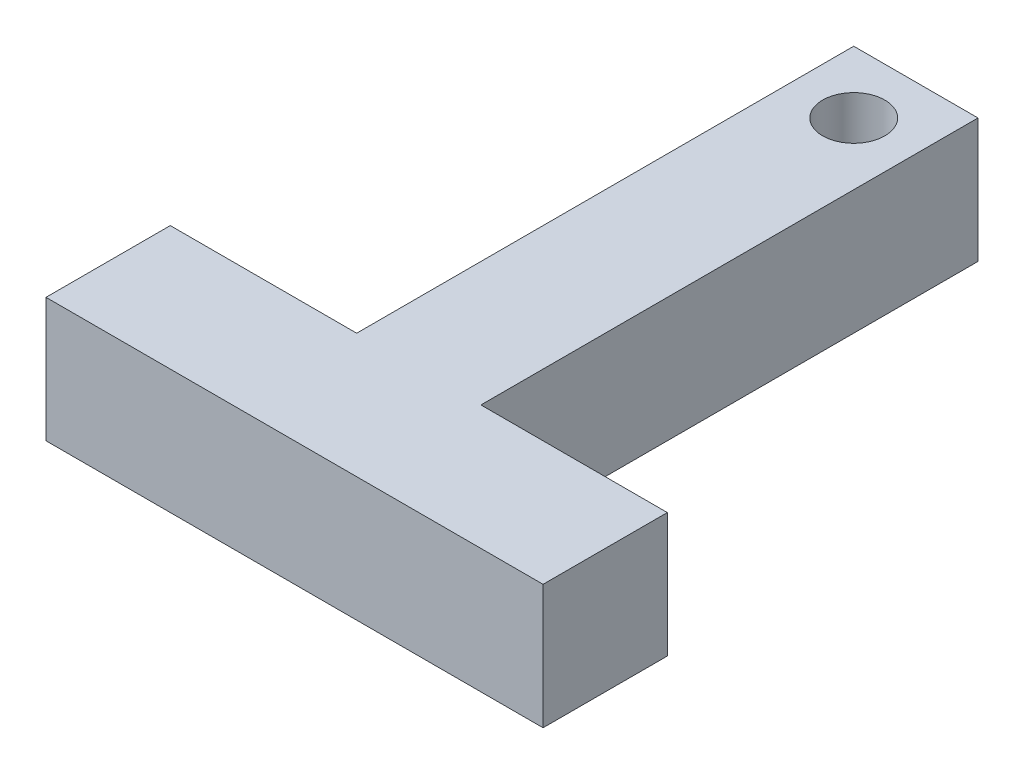
ISO-10303-21;
HEADER;
FILE_DESCRIPTION(('STEP AP214'),'2;1');
FILE_NAME('part.step','',(''),(''),'','','');
FILE_SCHEMA(('AUTOMOTIVE_DESIGN { 1 0 10303 214 1 1 1 1 }'));
ENDSEC;
DATA;
#1=APPLICATION_CONTEXT('core data for automotive mechanical design processes');
#2=APPLICATION_PROTOCOL_DEFINITION('international standard','automotive_design',2000,#1);
#3=PRODUCT_CONTEXT('',#1,'mechanical');
#4=PRODUCT('Part','Part','',(#3));
#5=PRODUCT_RELATED_PRODUCT_CATEGORY('part','',(#4));
#6=PRODUCT_DEFINITION_FORMATION('','',#4);
#7=PRODUCT_DEFINITION_CONTEXT('part definition',#1,'design');
#8=PRODUCT_DEFINITION('design','',#6,#7);
#9=PRODUCT_DEFINITION_SHAPE('','',#8);
#10=(LENGTH_UNIT() NAMED_UNIT(*) SI_UNIT(.MILLI.,.METRE.));
#11=(NAMED_UNIT(*) PLANE_ANGLE_UNIT() SI_UNIT($,.RADIAN.));
#12=(NAMED_UNIT(*) SI_UNIT($,.STERADIAN.) SOLID_ANGLE_UNIT());
#13=UNCERTAINTY_MEASURE_WITH_UNIT(LENGTH_MEASURE(1.E-05),#10,'distance_accuracy_value','');
#14=(GEOMETRIC_REPRESENTATION_CONTEXT(3) GLOBAL_UNCERTAINTY_ASSIGNED_CONTEXT((#13)) GLOBAL_UNIT_ASSIGNED_CONTEXT((#10,
#11,#12)) REPRESENTATION_CONTEXT('',''));
#15=CARTESIAN_POINT('',(0.,0.,0.));
#16=DIRECTION('',(0.,0.,1.));
#17=DIRECTION('',(1.,0.,0.));
#18=AXIS2_PLACEMENT_3D('',#15,#16,#17);
#19=CARTESIAN_POINT('',(1.99999999999999,1.,-35.7707081392257));
#20=DIRECTION('',(-1.,0.,0.));
#21=DIRECTION('',(0.,0.,1.));
#22=AXIS2_PLACEMENT_3D('',#19,#20,#21);
#23=PLANE('',#22);
#24=DIRECTION('',(0.,0.,-1.));
#25=VECTOR('',#24,1.);
#26=CARTESIAN_POINT('',(1.99999999999999,0.,-35.7707081392257));
#27=LINE('',#26,#25);
#28=CARTESIAN_POINT('',(1.99999999999999,0.,-34.7707081392257));
#29=VERTEX_POINT('',#28);
#30=CARTESIAN_POINT('',(1.99999999999999,0.,-35.7707081392257));
#31=VERTEX_POINT('',#30);
#32=EDGE_CURVE('E131',#29,#31,#27,.T.);
#33=ORIENTED_EDGE('',*,*,#32,.T.);
#34=DIRECTION('',(0.,-1.,0.));
#35=VECTOR('',#34,1.);
#36=CARTESIAN_POINT('',(1.99999999999999,1.,-35.7707081392257));
#37=LINE('',#36,#35);
#38=CARTESIAN_POINT('',(1.99999999999999,1.,-35.7707081392257));
#39=VERTEX_POINT('',#38);
#40=EDGE_CURVE('E11',#39,#31,#37,.T.);
#41=ORIENTED_EDGE('',*,*,#40,.F.);
#42=DIRECTION('',(0.,0.,-1.));
#43=VECTOR('',#42,1.);
#44=CARTESIAN_POINT('',(1.99999999999999,1.,-35.7707081392257));
#45=LINE('',#44,#43);
#46=CARTESIAN_POINT('',(1.99999999999999,1.,-34.7707081392257));
#47=VERTEX_POINT('',#46);
#48=EDGE_CURVE('E146',#47,#39,#45,.T.);
#49=ORIENTED_EDGE('',*,*,#48,.F.);
#50=DIRECTION('',(0.,-1.,0.));
#51=VECTOR('',#50,1.);
#52=CARTESIAN_POINT('',(1.99999999999999,1.,-34.7707081392257));
#53=LINE('',#52,#51);
#54=EDGE_CURVE('E127',#47,#29,#53,.T.);
#55=ORIENTED_EDGE('',*,*,#54,.T.);
#56=EDGE_LOOP('',(#33,#41,#49,#55));
#57=FACE_BOUND('',#56,.T.);
#58=ADVANCED_FACE('F35',(#57),#23,.F.);
#59=CARTESIAN_POINT('',(0.499999999999996,1.,-35.7707081392257));
#60=DIRECTION('',(0.,0.,1.));
#61=DIRECTION('',(1.,0.,0.));
#62=AXIS2_PLACEMENT_3D('',#59,#60,#61);
#63=PLANE('',#62);
#64=DIRECTION('',(-1.,0.,0.));
#65=VECTOR('',#64,1.);
#66=CARTESIAN_POINT('',(0.499999999999996,0.,-35.7707081392257));
#67=LINE('',#66,#65);
#68=CARTESIAN_POINT('',(0.499999999999996,0.,-35.7707081392257));
#69=VERTEX_POINT('',#68);
#70=EDGE_CURVE('E134',#31,#69,#67,.T.);
#71=ORIENTED_EDGE('',*,*,#70,.T.);
#72=DIRECTION('',(0.,-1.,0.));
#73=VECTOR('',#72,1.);
#74=CARTESIAN_POINT('',(0.499999999999996,1.,-35.7707081392257));
#75=LINE('',#74,#73);
#76=CARTESIAN_POINT('',(0.499999999999996,1.,-35.7707081392257));
#77=VERTEX_POINT('',#76);
#78=EDGE_CURVE('E43',#77,#69,#75,.T.);
#79=ORIENTED_EDGE('',*,*,#78,.F.);
#80=DIRECTION('',(-1.,0.,0.));
#81=VECTOR('',#80,1.);
#82=CARTESIAN_POINT('',(0.499999999999996,1.,-35.7707081392257));
#83=LINE('',#82,#81);
#84=EDGE_CURVE('E94',#39,#77,#83,.T.);
#85=ORIENTED_EDGE('',*,*,#84,.F.);
#86=ORIENTED_EDGE('',*,*,#40,.T.);
#87=EDGE_LOOP('',(#71,#79,#85,#86));
#88=FACE_BOUND('',#87,.T.);
#89=ADVANCED_FACE('F202',(#88),#63,.F.);
#90=CARTESIAN_POINT('',(0.499999999999995,1.,-39.7707081392257));
#91=DIRECTION('',(-1.,0.,0.));
#92=DIRECTION('',(0.,0.,1.));
#93=AXIS2_PLACEMENT_3D('',#90,#91,#92);
#94=PLANE('',#93);
#95=DIRECTION('',(0.,0.,-1.));
#96=VECTOR('',#95,1.);
#97=CARTESIAN_POINT('',(0.499999999999995,0.,-39.7707081392257));
#98=LINE('',#97,#96);
#99=CARTESIAN_POINT('',(0.499999999999995,0.,-39.7707081392257));
#100=VERTEX_POINT('',#99);
#101=EDGE_CURVE('E137',#69,#100,#98,.T.);
#102=ORIENTED_EDGE('',*,*,#101,.T.);
#103=DIRECTION('',(0.,-1.,0.));
#104=VECTOR('',#103,1.);
#105=CARTESIAN_POINT('',(0.499999999999995,1.,-39.7707081392257));
#106=LINE('',#105,#104);
#107=CARTESIAN_POINT('',(0.499999999999995,1.,-39.7707081392257));
#108=VERTEX_POINT('',#107);
#109=EDGE_CURVE('E153',#108,#100,#106,.T.);
#110=ORIENTED_EDGE('',*,*,#109,.F.);
#111=DIRECTION('',(0.,0.,-1.));
#112=VECTOR('',#111,1.);
#113=CARTESIAN_POINT('',(0.499999999999995,1.,-39.7707081392257));
#114=LINE('',#113,#112);
#115=EDGE_CURVE('E161',#77,#108,#114,.T.);
#116=ORIENTED_EDGE('',*,*,#115,.F.);
#117=ORIENTED_EDGE('',*,*,#78,.T.);
#118=EDGE_LOOP('',(#102,#110,#116,#117));
#119=FACE_BOUND('',#118,.T.);
#120=ADVANCED_FACE('F159',(#119),#94,.F.);
#121=CARTESIAN_POINT('',(-0.500000000000005,1.,-39.7707081392257));
#122=DIRECTION('',(0.,0.,1.));
#123=DIRECTION('',(1.,0.,0.));
#124=AXIS2_PLACEMENT_3D('',#121,#122,#123);
#125=PLANE('',#124);
#126=DIRECTION('',(-1.,0.,0.));
#127=VECTOR('',#126,1.);
#128=CARTESIAN_POINT('',(-0.500000000000005,0.,-39.7707081392257));
#129=LINE('',#128,#127);
#130=CARTESIAN_POINT('',(-0.500000000000005,0.,-39.7707081392257));
#131=VERTEX_POINT('',#130);
#132=EDGE_CURVE('E139',#100,#131,#129,.T.);
#133=ORIENTED_EDGE('',*,*,#132,.T.);
#134=DIRECTION('',(0.,-1.,0.));
#135=VECTOR('',#134,1.);
#136=CARTESIAN_POINT('',(-0.500000000000005,1.,-39.7707081392257));
#137=LINE('',#136,#135);
#138=CARTESIAN_POINT('',(-0.500000000000005,1.,-39.7707081392257));
#139=VERTEX_POINT('',#138);
#140=EDGE_CURVE('E150',#139,#131,#137,.T.);
#141=ORIENTED_EDGE('',*,*,#140,.F.);
#142=DIRECTION('',(-1.,0.,0.));
#143=VECTOR('',#142,1.);
#144=CARTESIAN_POINT('',(-0.500000000000005,1.,-39.7707081392257));
#145=LINE('',#144,#143);
#146=EDGE_CURVE('E173',#108,#139,#145,.T.);
#147=ORIENTED_EDGE('',*,*,#146,.F.);
#148=ORIENTED_EDGE('',*,*,#109,.T.);
#149=EDGE_LOOP('',(#133,#141,#147,#148));
#150=FACE_BOUND('',#149,.T.);
#151=ADVANCED_FACE('F169',(#150),#125,.F.);
#152=CARTESIAN_POINT('',(-0.500000000000005,1.,-39.7707081392257));
#153=DIRECTION('',(1.,0.,0.));
#154=DIRECTION('',(0.,0.,-1.));
#155=AXIS2_PLACEMENT_3D('',#152,#153,#154);
#156=PLANE('',#155);
#157=DIRECTION('',(0.,0.,1.));
#158=VECTOR('',#157,1.);
#159=CARTESIAN_POINT('',(-0.500000000000005,0.,-39.7707081392257));
#160=LINE('',#159,#158);
#161=CARTESIAN_POINT('',(-0.500000000000005,0.,-35.7707081392257));
#162=VERTEX_POINT('',#161);
#163=EDGE_CURVE('E141',#131,#162,#160,.T.);
#164=ORIENTED_EDGE('',*,*,#163,.T.);
#165=DIRECTION('',(0.,-1.,0.));
#166=VECTOR('',#165,1.);
#167=CARTESIAN_POINT('',(-0.500000000000005,1.,-35.7707081392257));
#168=LINE('',#167,#166);
#169=CARTESIAN_POINT('',(-0.500000000000005,1.,-35.7707081392257));
#170=VERTEX_POINT('',#169);
#171=EDGE_CURVE('E122',#170,#162,#168,.T.);
#172=ORIENTED_EDGE('',*,*,#171,.F.);
#173=DIRECTION('',(0.,0.,1.));
#174=VECTOR('',#173,1.);
#175=CARTESIAN_POINT('',(-0.500000000000005,1.,-39.7707081392257));
#176=LINE('',#175,#174);
#177=EDGE_CURVE('E113',#139,#170,#176,.T.);
#178=ORIENTED_EDGE('',*,*,#177,.F.);
#179=ORIENTED_EDGE('',*,*,#140,.T.);
#180=EDGE_LOOP('',(#164,#172,#178,#179));
#181=FACE_BOUND('',#180,.T.);
#182=ADVANCED_FACE('F172',(#181),#156,.F.);
#183=CARTESIAN_POINT('',(-2.00000000000001,1.,-35.7707081392257));
#184=DIRECTION('',(0.,0.,1.));
#185=DIRECTION('',(1.,0.,0.));
#186=AXIS2_PLACEMENT_3D('',#183,#184,#185);
#187=PLANE('',#186);
#188=DIRECTION('',(-1.,0.,0.));
#189=VECTOR('',#188,1.);
#190=CARTESIAN_POINT('',(-2.00000000000001,0.,-35.7707081392257));
#191=LINE('',#190,#189);
#192=CARTESIAN_POINT('',(-2.00000000000001,0.,-35.7707081392257));
#193=VERTEX_POINT('',#192);
#194=EDGE_CURVE('E121',#162,#193,#191,.T.);
#195=ORIENTED_EDGE('',*,*,#194,.T.);
#196=DIRECTION('',(0.,-1.,0.));
#197=VECTOR('',#196,1.);
#198=CARTESIAN_POINT('',(-2.00000000000001,1.,-35.7707081392257));
#199=LINE('',#198,#197);
#200=CARTESIAN_POINT('',(-2.00000000000001,1.,-35.7707081392257));
#201=VERTEX_POINT('',#200);
#202=EDGE_CURVE('E118',#201,#193,#199,.T.);
#203=ORIENTED_EDGE('',*,*,#202,.F.);
#204=DIRECTION('',(-1.,0.,0.));
#205=VECTOR('',#204,1.);
#206=CARTESIAN_POINT('',(-2.00000000000001,1.,-35.7707081392257));
#207=LINE('',#206,#205);
#208=EDGE_CURVE('E107',#170,#201,#207,.T.);
#209=ORIENTED_EDGE('',*,*,#208,.F.);
#210=ORIENTED_EDGE('',*,*,#171,.T.);
#211=EDGE_LOOP('',(#195,#203,#209,#210));
#212=FACE_BOUND('',#211,.T.);
#213=ADVANCED_FACE('F119',(#212),#187,.F.);
#214=CARTESIAN_POINT('',(-2.00000000000001,1.,-35.7707081392257));
#215=DIRECTION('',(1.,0.,0.));
#216=DIRECTION('',(0.,0.,-1.));
#217=AXIS2_PLACEMENT_3D('',#214,#215,#216);
#218=PLANE('',#217);
#219=DIRECTION('',(0.,0.,1.));
#220=VECTOR('',#219,1.);
#221=CARTESIAN_POINT('',(-2.00000000000001,0.,-35.7707081392257));
#222=LINE('',#221,#220);
#223=CARTESIAN_POINT('',(-2.00000000000001,0.,-34.7707081392257));
#224=VERTEX_POINT('',#223);
#225=EDGE_CURVE('E80',#193,#224,#222,.T.);
#226=ORIENTED_EDGE('',*,*,#225,.T.);
#227=DIRECTION('',(0.,-1.,0.));
#228=VECTOR('',#227,1.);
#229=CARTESIAN_POINT('',(-2.00000000000001,1.,-34.7707081392257));
#230=LINE('',#229,#228);
#231=CARTESIAN_POINT('',(-2.00000000000001,1.,-34.7707081392257));
#232=VERTEX_POINT('',#231);
#233=EDGE_CURVE('E123',#232,#224,#230,.T.);
#234=ORIENTED_EDGE('',*,*,#233,.F.);
#235=DIRECTION('',(0.,0.,1.));
#236=VECTOR('',#235,1.);
#237=CARTESIAN_POINT('',(-2.00000000000001,1.,-35.7707081392257));
#238=LINE('',#237,#236);
#239=EDGE_CURVE('E111',#201,#232,#238,.T.);
#240=ORIENTED_EDGE('',*,*,#239,.F.);
#241=ORIENTED_EDGE('',*,*,#202,.T.);
#242=EDGE_LOOP('',(#226,#234,#240,#241));
#243=FACE_BOUND('',#242,.T.);
#244=ADVANCED_FACE('F125',(#243),#218,.F.);
#245=CARTESIAN_POINT('',(-2.00000000000001,1.,-34.7707081392257));
#246=DIRECTION('',(0.,0.,-1.));
#247=DIRECTION('',(-1.,0.,0.));
#248=AXIS2_PLACEMENT_3D('',#245,#246,#247);
#249=PLANE('',#248);
#250=DIRECTION('',(1.,0.,0.));
#251=VECTOR('',#250,1.);
#252=CARTESIAN_POINT('',(-2.00000000000001,0.,-34.7707081392257));
#253=LINE('',#252,#251);
#254=EDGE_CURVE('E86',#224,#29,#253,.T.);
#255=ORIENTED_EDGE('',*,*,#254,.T.);
#256=ORIENTED_EDGE('',*,*,#54,.F.);
#257=DIRECTION('',(1.,0.,0.));
#258=VECTOR('',#257,1.);
#259=CARTESIAN_POINT('',(-2.00000000000001,1.,-34.7707081392257));
#260=LINE('',#259,#258);
#261=EDGE_CURVE('E51',#232,#47,#260,.T.);
#262=ORIENTED_EDGE('',*,*,#261,.F.);
#263=ORIENTED_EDGE('',*,*,#233,.T.);
#264=EDGE_LOOP('',(#255,#256,#262,#263));
#265=FACE_BOUND('',#264,.T.);
#266=ADVANCED_FACE('F193',(#265),#249,.F.);
#267=CARTESIAN_POINT('',(0.,1.,0.));
#268=DIRECTION('',(0.,1.,0.));
#269=DIRECTION('',(0.,0.,1.));
#270=AXIS2_PLACEMENT_3D('',#267,#268,#269);
#271=PLANE('',#270);
#272=CARTESIAN_POINT('',(0.,1.,-39.2707081392257));
#273=DIRECTION('',(0.,1.,0.));
#274=DIRECTION('',(0.,0.,1.));
#275=AXIS2_PLACEMENT_3D('',#272,#273,#274);
#276=CIRCLE('',#275,0.25);
#277=CARTESIAN_POINT('',(0.,1.,-39.0207081392257));
#278=VERTEX_POINT('',#277);
#279=EDGE_CURVE('E179',#278,#278,#276,.T.);
#280=ORIENTED_EDGE('',*,*,#279,.F.);
#281=EDGE_LOOP('',(#280));
#282=FACE_BOUND('',#281,.T.);
#283=ORIENTED_EDGE('',*,*,#48,.T.);
#284=ORIENTED_EDGE('',*,*,#84,.T.);
#285=ORIENTED_EDGE('',*,*,#115,.T.);
#286=ORIENTED_EDGE('',*,*,#146,.T.);
#287=ORIENTED_EDGE('',*,*,#177,.T.);
#288=ORIENTED_EDGE('',*,*,#208,.T.);
#289=ORIENTED_EDGE('',*,*,#239,.T.);
#290=ORIENTED_EDGE('',*,*,#261,.T.);
#291=EDGE_LOOP('',(#283,#284,#285,#286,#287,#288,#289,#290));
#292=FACE_BOUND('',#291,.T.);
#293=ADVANCED_FACE('F109',(#282,#292),#271,.T.);
#294=CARTESIAN_POINT('',(0.,0.,0.));
#295=DIRECTION('',(0.,1.,0.));
#296=DIRECTION('',(0.,0.,1.));
#297=AXIS2_PLACEMENT_3D('',#294,#295,#296);
#298=PLANE('',#297);
#299=CARTESIAN_POINT('',(0.,0.,-39.2707081392257));
#300=DIRECTION('',(0.,1.,0.));
#301=DIRECTION('',(0.,0.,1.));
#302=AXIS2_PLACEMENT_3D('',#299,#300,#301);
#303=CIRCLE('',#302,0.25);
#304=CARTESIAN_POINT('',(0.,0.,-39.0207081392257));
#305=VERTEX_POINT('',#304);
#306=EDGE_CURVE('E135',#305,#305,#303,.T.);
#307=ORIENTED_EDGE('',*,*,#306,.T.);
#308=EDGE_LOOP('',(#307));
#309=FACE_BOUND('',#308,.T.);
#310=ORIENTED_EDGE('',*,*,#32,.F.);
#311=ORIENTED_EDGE('',*,*,#254,.F.);
#312=ORIENTED_EDGE('',*,*,#225,.F.);
#313=ORIENTED_EDGE('',*,*,#194,.F.);
#314=ORIENTED_EDGE('',*,*,#163,.F.);
#315=ORIENTED_EDGE('',*,*,#132,.F.);
#316=ORIENTED_EDGE('',*,*,#101,.F.);
#317=ORIENTED_EDGE('',*,*,#70,.F.);
#318=EDGE_LOOP('',(#310,#311,#312,#313,#314,#315,#316,#317));
#319=FACE_BOUND('',#318,.T.);
#320=ADVANCED_FACE('F165',(#309,#319),#298,.F.);
#321=CARTESIAN_POINT('',(0.,0.,-39.2707081392257));
#322=DIRECTION('',(0.,1.,0.));
#323=DIRECTION('',(0.,0.,1.));
#324=AXIS2_PLACEMENT_3D('',#321,#322,#323);
#325=CYLINDRICAL_SURFACE('',#324,0.25);
#326=ORIENTED_EDGE('',*,*,#306,.F.);
#327=EDGE_LOOP('',(#326));
#328=FACE_BOUND('',#327,.T.);
#329=ORIENTED_EDGE('',*,*,#279,.T.);
#330=EDGE_LOOP('',(#329));
#331=FACE_BOUND('',#330,.T.);
#332=ADVANCED_FACE('F186',(#328,#331),#325,.F.);
#333=CLOSED_SHELL('',(#58,#89,#120,#151,#182,#213,#244,#266,#293,#320,#332));
#334=MANIFOLD_SOLID_BREP('B2',#333);
#335=ADVANCED_BREP_SHAPE_REPRESENTATION('',(#18,#334),#14);
#336=SHAPE_DEFINITION_REPRESENTATION(#9,#335);
ENDSEC;
END-ISO-10303-21;
